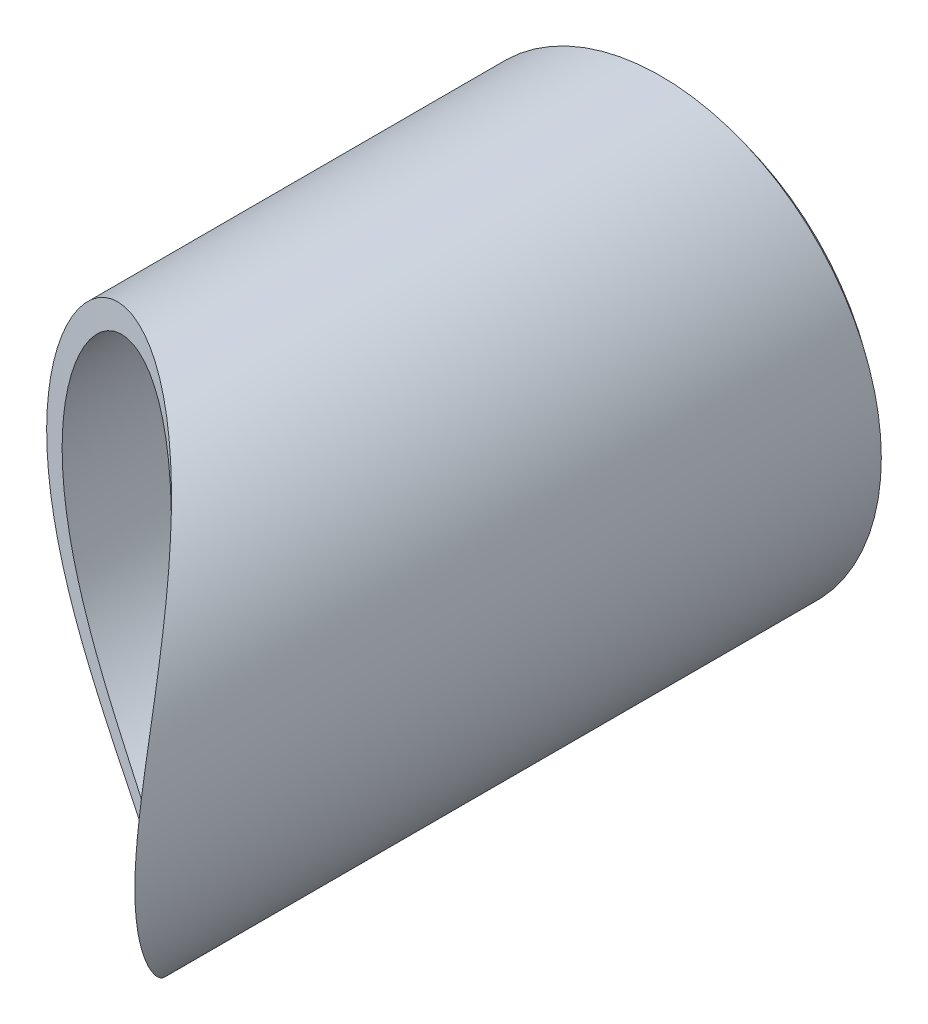
ISO-10303-21;
HEADER;
FILE_DESCRIPTION(('STEP AP214'),'2;1');
FILE_NAME('part.step','',(''),(''),'','','');
FILE_SCHEMA(('AUTOMOTIVE_DESIGN { 1 0 10303 214 1 1 1 1 }'));
ENDSEC;
DATA;
#1=APPLICATION_CONTEXT('core data for automotive mechanical design processes');
#2=APPLICATION_PROTOCOL_DEFINITION('international standard','automotive_design',2000,#1);
#3=PRODUCT_CONTEXT('',#1,'mechanical');
#4=PRODUCT('Part','Part','',(#3));
#5=PRODUCT_RELATED_PRODUCT_CATEGORY('part','',(#4));
#6=PRODUCT_DEFINITION_FORMATION('','',#4);
#7=PRODUCT_DEFINITION_CONTEXT('part definition',#1,'design');
#8=PRODUCT_DEFINITION('design','',#6,#7);
#9=PRODUCT_DEFINITION_SHAPE('','',#8);
#10=(LENGTH_UNIT() NAMED_UNIT(*) SI_UNIT(.MILLI.,.METRE.));
#11=(NAMED_UNIT(*) PLANE_ANGLE_UNIT() SI_UNIT($,.RADIAN.));
#12=(NAMED_UNIT(*) SI_UNIT($,.STERADIAN.) SOLID_ANGLE_UNIT());
#13=UNCERTAINTY_MEASURE_WITH_UNIT(LENGTH_MEASURE(1.E-05),#10,'distance_accuracy_value','');
#14=(GEOMETRIC_REPRESENTATION_CONTEXT(3) GLOBAL_UNCERTAINTY_ASSIGNED_CONTEXT((#13)) GLOBAL_UNIT_ASSIGNED_CONTEXT((#10,
#11,#12)) REPRESENTATION_CONTEXT('',''));
#15=CARTESIAN_POINT('',(0.,0.,0.));
#16=DIRECTION('',(0.,0.,1.));
#17=DIRECTION('',(1.,0.,0.));
#18=AXIS2_PLACEMENT_3D('',#15,#16,#17);
#19=CARTESIAN_POINT('',(0.,0.,98.425));
#20=DIRECTION('',(0.,0.,-1.));
#21=DIRECTION('',(-1.,0.,0.));
#22=AXIS2_PLACEMENT_3D('',#19,#20,#21);
#23=CYLINDRICAL_SURFACE('',#22,57.15);
#24=CARTESIAN_POINT('',(0.,0.,-95.0142315384335));
#25=DIRECTION('',(0.,0.,1.));
#26=DIRECTION('',(1.,0.,0.));
#27=AXIS2_PLACEMENT_3D('',#24,#25,#26);
#28=CIRCLE('',#27,57.15);
#29=CARTESIAN_POINT('',(57.15,0.,-95.0142315384335));
#30=VERTEX_POINT('',#29);
#31=EDGE_CURVE('E40',#30,#30,#28,.T.);
#32=ORIENTED_EDGE('',*,*,#31,.T.);
#33=EDGE_LOOP('',(#32));
#34=FACE_BOUND('',#33,.T.);
#35=CARTESIAN_POINT('',(57.15,0.,98.425));
#36=CARTESIAN_POINT('',(57.1499910400775,0.889774064658412,98.4249811147719));
#37=CARTESIAN_POINT('',(57.129162954309,1.77977253431634,98.3892348738455));
#38=CARTESIAN_POINT('',(57.0463978204173,3.55233045125769,98.2474793506042));
#39=CARTESIAN_POINT('',(56.9844476317462,4.43488742929305,98.1414476086068));
#40=CARTESIAN_POINT('',(56.8209401864099,6.18696293682297,97.8625519580691));
#41=CARTESIAN_POINT('',(56.7193232853382,7.05645977431301,97.6895874101758));
#42=CARTESIAN_POINT('',(56.4788981873427,8.77555385253664,97.2822475916354));
#43=CARTESIAN_POINT('',(56.3400878038766,9.62514992014327,97.0478687105607));
#44=CARTESIAN_POINT('',(55.9823478883623,11.546118004802,96.4472710214036));
#45=CARTESIAN_POINT('',(55.7518600610972,12.6095601507823,96.0625437758566));
#46=CARTESIAN_POINT('',(55.2396230085673,14.6921007305199,95.2152959598074));
#47=CARTESIAN_POINT('',(54.9578555500323,15.7111832312909,94.7527477232755));
#48=CARTESIAN_POINT('',(54.3483205300181,17.7051282811029,93.7624435495457));
#49=CARTESIAN_POINT('',(54.0204662717516,18.6799027974211,93.2345649444043));
#50=CARTESIAN_POINT('',(53.3241381783846,20.583641304642,92.1260683753142));
#51=CARTESIAN_POINT('',(52.9556637538368,21.5126046304861,91.5454496460647));
#52=CARTESIAN_POINT('',(52.2466700882524,23.1750447203111,90.4417426519371));
#53=CARTESIAN_POINT('',(51.9117296542151,23.9152949075571,89.925198006992));
#54=CARTESIAN_POINT('',(51.2183217018574,25.3663701142107,88.8669913293644));
#55=CARTESIAN_POINT('',(50.8598507591494,26.0771908261004,88.3253256442061));
#56=CARTESIAN_POINT('',(50.1208144042784,27.4708741560089,87.2206977474642));
#57=CARTESIAN_POINT('',(49.7402372133352,28.1537215325026,86.6577242392219));
#58=CARTESIAN_POINT('',(48.9584667422615,29.492230948926,85.5141770962944));
#59=CARTESIAN_POINT('',(48.5572742816129,30.1478940675938,84.9336041615834));
#60=CARTESIAN_POINT('',(47.7345297059954,31.4343962996623,83.756596883183));
#61=CARTESIAN_POINT('',(47.3129402346351,32.0651857044664,83.1601344107175));
#62=CARTESIAN_POINT('',(46.4509771401314,33.3016086068696,81.9548773370721));
#63=CARTESIAN_POINT('',(46.0106035433338,33.907242139749,81.3460827531894));
#64=CARTESIAN_POINT('',(45.1118498976267,35.094123636382,80.1183651231164));
#65=CARTESIAN_POINT('',(44.6534727473047,35.6753754946963,79.4994437166386));
#66=CARTESIAN_POINT('',(43.7192180061092,36.8143308711072,78.2531806201155));
#67=CARTESIAN_POINT('',(43.2433396767154,37.3720333933233,77.6258385754445));
#68=CARTESIAN_POINT('',(42.0370895815125,38.7322810608782,76.0550948522332));
#69=CARTESIAN_POINT('',(41.2963202785646,39.5208294157321,75.1075134388928));
#70=CARTESIAN_POINT('',(39.7782619560218,41.0484086065906,73.2016781205528));
#71=CARTESIAN_POINT('',(39.0009698547732,41.7874352513336,72.243423320197));
#72=CARTESIAN_POINT('',(37.410596597428,43.2170499976349,70.3196975018225));
#73=CARTESIAN_POINT('',(36.597501923324,43.9076195434993,69.3542238744089));
#74=CARTESIAN_POINT('',(34.9366514206708,45.2403187689698,67.4197361000174));
#75=CARTESIAN_POINT('',(34.088896456959,45.8824496560727,66.4507220419286));
#76=CARTESIAN_POINT('',(32.3587259914679,47.118644270921,64.5112569691816));
#77=CARTESIAN_POINT('',(31.4762831040879,47.7126688394741,63.5408054258426));
#78=CARTESIAN_POINT('',(29.678052148702,48.8514926273532,61.6018965787861));
#79=CARTESIAN_POINT('',(28.7622638939403,49.3962915709239,60.6334392862699));
#80=CARTESIAN_POINT('',(26.8981878754473,50.4355876511352,58.701154187758));
#81=CARTESIAN_POINT('',(25.9499054216804,50.9300929544814,57.7373256544375));
#82=CARTESIAN_POINT('',(24.0214554925153,51.8675387710817,55.8164942746231));
#83=CARTESIAN_POINT('',(23.041288064078,52.3104793602771,54.8594914180787));
#84=CARTESIAN_POINT('',(21.0442144480685,53.1454759309505,52.9491214374591));
#85=CARTESIAN_POINT('',(20.0271295828837,53.5372250404192,51.9958067658356));
#86=CARTESIAN_POINT('',(17.9626343561866,54.2647593376736,50.100680061435));
#87=CARTESIAN_POINT('',(16.9152238755295,54.6005443055496,49.1588680738708));
#88=CARTESIAN_POINT('',(14.7911352730209,55.2138299343915,47.2888453312902));
#89=CARTESIAN_POINT('',(13.7144509519428,55.4913181397406,46.3606375222548));
#90=CARTESIAN_POINT('',(11.5336096495677,55.9852508595995,44.5203601180559));
#91=CARTESIAN_POINT('',(10.4294529575446,56.2016960165744,43.6082903531377));
#92=CARTESIAN_POINT('',(8.19864512181479,56.5701265804876,41.805123590438));
#93=CARTESIAN_POINT('',(7.07206411954917,56.7222874631779,40.9139758533363));
#94=CARTESIAN_POINT('',(4.79576027825083,56.9599219807964,39.1524362355535));
#95=CARTESIAN_POINT('',(3.64603665254457,57.045393344847,38.2820450626426));
#96=CARTESIAN_POINT('',(1.32687088171356,57.1463760219798,36.5649319291847));
#97=CARTESIAN_POINT('',(0.157439279738828,57.1619236197947,35.7181979192582));
#98=CARTESIAN_POINT('',(-2.19816989984599,57.1198571615412,34.0505548148042));
#99=CARTESIAN_POINT('',(-3.38434519684025,57.0622529759937,33.2296422514508));
#100=CARTESIAN_POINT('',(-6.13111740728365,56.8415539341557,31.3715191157478));
#101=CARTESIAN_POINT('',(-7.6963027361189,56.6517922369752,30.3441045588633));
#102=CARTESIAN_POINT('',(-10.8382300462999,56.1354459376978,28.3427616871965));
#103=CARTESIAN_POINT('',(-12.4149695973508,55.8088893406908,27.3688224709052));
#104=CARTESIAN_POINT('',(-14.7788879786162,55.2120265168169,25.9522517433848));
#105=CARTESIAN_POINT('',(-15.5666352606521,54.995243532456,25.4874663776447));
#106=CARTESIAN_POINT('',(-17.1401295107344,54.5253368998854,24.5731906261596));
#107=CARTESIAN_POINT('',(-17.9258766707631,54.2722168845194,24.1236987169812));
#108=CARTESIAN_POINT('',(-19.4936580789043,53.7290257899441,23.2405227047032));
#109=CARTESIAN_POINT('',(-20.2756916920669,53.4389486120922,22.8068412258546));
#110=CARTESIAN_POINT('',(-21.8338589813834,52.8214661343986,21.9559563486431));
#111=CARTESIAN_POINT('',(-22.6099932946391,52.4940649283068,21.5387511498848));
#112=CARTESIAN_POINT('',(-24.1599343489337,51.7990983445948,20.7183246395271));
#113=CARTESIAN_POINT('',(-24.9336837648162,51.4312598877336,20.3152261306498));
#114=CARTESIAN_POINT('',(-26.4708364384821,50.6572571094413,19.5267193398757));
#115=CARTESIAN_POINT('',(-27.2342408999128,50.2510972913,19.1413089872686));
#116=CARTESIAN_POINT('',(-28.7485985778376,49.4003536969144,18.3884661272164));
#117=CARTESIAN_POINT('',(-29.499549851845,48.9557639922136,18.0210364073281));
#118=CARTESIAN_POINT('',(-30.986407283913,48.0284563190657,17.30458932782));
#119=CARTESIAN_POINT('',(-31.7223153210676,47.5457431498208,16.9555696598333));
#120=CARTESIAN_POINT('',(-33.1766134662327,46.5426144843583,16.2762124838732));
#121=CARTESIAN_POINT('',(-33.8950071261989,46.0222067191473,15.9458711696549));
#122=CARTESIAN_POINT('',(-35.311904217798,44.9442344679221,15.3040046257855));
#123=CARTESIAN_POINT('',(-36.0104101338126,44.386674652276,14.9924770404196));
#124=CARTESIAN_POINT('',(-37.3851607507702,43.2351272840137,14.3882966085619));
#125=CARTESIAN_POINT('',(-38.0614063120514,42.6411411417814,14.09564303219));
#126=CARTESIAN_POINT('',(-39.3892431423975,41.4176888470301,13.5292149823365));
#127=CARTESIAN_POINT('',(-40.0408351958803,40.7882238249566,13.2554399079561));
#128=CARTESIAN_POINT('',(-41.2424789346498,39.5704974243617,12.7575810449001));
#129=CARTESIAN_POINT('',(-41.7955022558026,38.986008901365,12.5314279671447));
#130=CARTESIAN_POINT('',(-42.8789615870869,37.7911046997486,12.0936808460015));
#131=CARTESIAN_POINT('',(-43.4093957282115,37.1806868840783,11.8820880064251));
#132=CARTESIAN_POINT('',(-44.4460084306339,35.9350977325234,11.4733898747764));
#133=CARTESIAN_POINT('',(-44.9521910259903,35.2999305456041,11.2762821702804));
#134=CARTESIAN_POINT('',(-45.9389869544839,34.0057962403385,10.8963309114666));
#135=CARTESIAN_POINT('',(-46.4195976518099,33.3468266802816,10.7134888266683));
#136=CARTESIAN_POINT('',(-47.3536235888651,32.0066198871775,10.3619659721538));
#137=CARTESIAN_POINT('',(-47.8070492537591,31.3253913470648,10.1932797637643));
#138=CARTESIAN_POINT('',(-48.6856470256179,29.9416435472693,9.86975517680552));
#139=CARTESIAN_POINT('',(-49.110816014081,29.2391219500299,9.71491832604776));
#140=CARTESIAN_POINT('',(-49.9315678232594,27.8143284612098,9.41889901597043));
#141=CARTESIAN_POINT('',(-50.3271545614664,27.0920592021161,9.27771474795042));
#142=CARTESIAN_POINT('',(-51.0877100098174,25.6290489424602,9.00871886651831));
#143=CARTESIAN_POINT('',(-51.4526758319303,24.8883062080882,8.88090851419522));
#144=CARTESIAN_POINT('',(-52.1276972604151,23.4397324989081,8.64648738129622));
#145=CARTESIAN_POINT('',(-52.4397902176008,22.7329864997053,8.53903217586433));
#146=CARTESIAN_POINT('',(-53.0356109247093,21.305970729964,8.33536088528168));
#147=CARTESIAN_POINT('',(-53.3193361516448,20.5856997632881,8.23914579968389));
#148=CARTESIAN_POINT('',(-53.8576576073134,19.1330868348688,8.05778204929041));
#149=CARTESIAN_POINT('',(-54.1122580249787,18.4007466263855,7.97263179283409));
#150=CARTESIAN_POINT('',(-54.5917706670708,16.9252232283236,7.81319380322691));
#151=CARTESIAN_POINT('',(-54.8166800485391,16.1820390079708,7.73890711020423));
#152=CARTESIAN_POINT('',(-55.4459199465276,13.9385547643318,7.53211583393716));
#153=CARTESIAN_POINT('',(-55.8049720923367,12.4237572136752,7.41560992135089));
#154=CARTESIAN_POINT('',(-56.3985377154593,9.36758021239772,7.22419998078131));
#155=CARTESIAN_POINT('',(-56.6330508675601,7.82620069237329,7.14929606143468));
#156=CARTESIAN_POINT('',(-56.9726876553426,4.75262276635806,7.04112985792062));
#157=CARTESIAN_POINT('',(-57.0798104911138,3.2206684470571,7.00722402375374));
#158=CARTESIAN_POINT('',(-57.1703969135752,0.152773116513686,6.97853941765266));
#159=CARTESIAN_POINT('',(-57.1538623173344,-1.38316783581614,6.98376007077907));
#160=CARTESIAN_POINT('',(-56.9972944143036,-4.44807704255366,7.03338195613771));
#161=CARTESIAN_POINT('',(-56.8572636074281,-5.97704543747601,7.0777823952596));
#162=CARTESIAN_POINT('',(-56.454979904614,-9.01713577617056,7.20623920209328));
#163=CARTESIAN_POINT('',(-56.1927267629719,-10.5282576840597,7.29029564952548));
#164=CARTESIAN_POINT('',(-55.5489710919375,-13.5192571100119,7.49874176723635));
#165=CARTESIAN_POINT('',(-55.1676787463672,-14.9991848278466,7.62306036223525));
#166=CARTESIAN_POINT('',(-54.2892245959994,-17.9200543902778,7.91324788210645));
#167=CARTESIAN_POINT('',(-53.7920632691397,-19.3609963956558,8.0791166355924));
#168=CARTESIAN_POINT('',(-52.6865597109506,-22.1937006706836,8.4538012387911));
#169=CARTESIAN_POINT('',(-52.0782243202989,-23.5854659599534,8.6626144461775));
#170=CARTESIAN_POINT('',(-50.7561264207044,-26.3102884453695,9.1247233755364));
#171=CARTESIAN_POINT('',(-50.042363713209,-27.6433455309437,9.37801918128366));
#172=CARTESIAN_POINT('',(-48.5138691475723,-30.2458502360163,9.93148677132656));
#173=CARTESIAN_POINT('',(-47.6988271234065,-31.5150848587846,10.2318033240382));
#174=CARTESIAN_POINT('',(-45.9775028173572,-33.9771681855979,10.8801308662355));
#175=CARTESIAN_POINT('',(-45.0712207805386,-35.1700170947959,11.2281417276181));
#176=CARTESIAN_POINT('',(-43.1763042802536,-37.4720115156937,11.9729720047747));
#177=CARTESIAN_POINT('',(-42.1876730389934,-38.5811602992255,12.369789511104));
#178=CARTESIAN_POINT('',(-40.1376185764926,-40.7096737260898,13.2129829481291));
#179=CARTESIAN_POINT('',(-39.0761943679625,-41.7290371512368,13.6593595510449));
#180=CARTESIAN_POINT('',(-36.8685127311026,-43.6928121719322,14.6114912957127));
#181=CARTESIAN_POINT('',(-35.7209716526914,-44.6352851332897,15.1182668251881));
#182=CARTESIAN_POINT('',(-33.3717272127158,-46.4179353671675,16.1833694518489));
#183=CARTESIAN_POINT('',(-32.1700234160121,-47.2581118176439,16.7416969632371));
#184=CARTESIAN_POINT('',(-29.7234083057624,-48.8339956092412,17.9090574684098));
#185=CARTESIAN_POINT('',(-28.478492623711,-49.5696923494837,18.5180955975409));
#186=CARTESIAN_POINT('',(-25.9563665897467,-50.9357109999795,19.7853488121546));
#187=CARTESIAN_POINT('',(-24.679155130327,-51.5660292908722,20.4435655856192));
#188=CARTESIAN_POINT('',(-22.0173932444875,-52.7600513312128,21.8523472180923));
#189=CARTESIAN_POINT('',(-20.6313349965076,-53.3165811278752,22.606140984983));
#190=CARTESIAN_POINT('',(-17.8457671197713,-54.3124233866673,24.1643994505471));
#191=CARTESIAN_POINT('',(-16.4462569768705,-54.7517313498596,24.9688660925653));
#192=CARTESIAN_POINT('',(-13.6436899647172,-55.5165101950275,26.6253762649662));
#193=CARTESIAN_POINT('',(-12.2406319827773,-55.8419392605832,27.4774371390877));
#194=CARTESIAN_POINT('',(-9.44061818299503,-56.3828948506311,29.2251957556841));
#195=CARTESIAN_POINT('',(-8.0436626508633,-56.5984162828897,30.1208955179274));
#196=CARTESIAN_POINT('',(-5.07339591819372,-56.9465943949303,32.0774972973791));
#197=CARTESIAN_POINT('',(-3.50211896791251,-57.063870324689,33.1442301442493));
#198=CARTESIAN_POINT('',(-0.387302576644447,-57.1699355306245,35.3234491160523));
#199=CARTESIAN_POINT('',(1.15623463615178,-57.1587145310959,36.4359388930094));
#200=CARTESIAN_POINT('',(4.20788070988051,-57.015346737565,38.7010530479708));
#201=CARTESIAN_POINT('',(5.71598656091115,-56.8831897078457,39.8536808152087));
#202=CARTESIAN_POINT('',(8.69050393665073,-56.5052710435671,42.1934211087785));
#203=CARTESIAN_POINT('',(10.1569135967963,-56.2595043370835,43.3805351724789));
#204=CARTESIAN_POINT('',(13.3332599264386,-55.6010761648655,46.0253336369455));
#205=CARTESIAN_POINT('',(15.0329516747082,-55.1648080375816,47.4894722771992));
#206=CARTESIAN_POINT('',(18.3591922227509,-54.1487534549558,50.4506884091224));
#207=CARTESIAN_POINT('',(19.985731741598,-53.5689488492967,51.9477700446336));
#208=CARTESIAN_POINT('',(23.164351192207,-52.2731994503254,54.9689119462933));
#209=CARTESIAN_POINT('',(24.7162676472846,-51.5569714206926,56.4930222497846));
#210=CARTESIAN_POINT('',(27.738671834637,-49.9958194024582,59.5560738128631));
#211=CARTESIAN_POINT('',(29.2091596915399,-49.1508956108356,61.095015049747));
#212=CARTESIAN_POINT('',(31.5018205665501,-47.6949270845771,63.5691773196806));
#213=CARTESIAN_POINT('',(32.350812762759,-47.1231876822518,64.5029544642687));
#214=CARTESIAN_POINT('',(34.0173743777513,-45.9346101408926,66.3700069016476));
#215=CARTESIAN_POINT('',(34.8349426762976,-45.3177703963382,67.3032821753799));
#216=CARTESIAN_POINT('',(36.4383039562831,-44.03889871684,69.1670873070171));
#217=CARTESIAN_POINT('',(37.2240822728251,-43.3768462951779,70.097615718359));
#218=CARTESIAN_POINT('',(38.7627354416338,-42.0075406478318,71.9525832769221));
#219=CARTESIAN_POINT('',(39.5156110250146,-41.3002884273694,72.8770225590584));
#220=CARTESIAN_POINT('',(40.9854729311116,-39.8419662276048,74.7138435662787));
#221=CARTESIAN_POINT('',(41.7025565148637,-39.0910285292224,75.6262523803004));
#222=CARTESIAN_POINT('',(43.1021074001536,-37.5422473911112,77.4379087676232));
#223=CARTESIAN_POINT('',(43.7845725321977,-36.7444010184244,78.3371555135682));
#224=CARTESIAN_POINT('',(45.1128903281482,-35.1007873910761,80.1170691247188));
#225=CARTESIAN_POINT('',(45.7587721440599,-34.2550593977277,80.9977504224661));
#226=CARTESIAN_POINT('',(47.012559115436,-32.5129725966537,82.7354763837304));
#227=CARTESIAN_POINT('',(47.6204720213412,-31.6166241934711,83.5925258510367));
#228=CARTESIAN_POINT('',(48.730643831049,-29.8729464740768,85.1825204821126));
#229=CARTESIAN_POINT('',(49.237135731438,-29.0312429407893,85.9186713627392));
#230=CARTESIAN_POINT('',(50.2159619401451,-27.3032168823223,87.3606428586062));
#231=CARTESIAN_POINT('',(50.6883003639872,-26.4168997550245,88.066467124057));
#232=CARTESIAN_POINT('',(51.5965886951204,-24.5957601671128,89.4412274403981));
#233=CARTESIAN_POINT('',(52.0324868672895,-23.6608717004831,90.1101106030707));
#234=CARTESIAN_POINT('',(52.8633825521465,-21.7411830853815,91.4004579266258));
#235=CARTESIAN_POINT('',(53.258378920882,-20.7563815420744,92.0219207611164));
#236=CARTESIAN_POINT('',(54.0086493304506,-18.7186100425273,93.2152663944184));
#237=CARTESIAN_POINT('',(54.3631761313386,-17.6647941572697,93.7861827998779));
#238=CARTESIAN_POINT('',(55.0188118640045,-15.5025196006315,94.8522276374408));
#239=CARTESIAN_POINT('',(55.3199101411214,-14.3940500864734,95.3473409502753));
#240=CARTESIAN_POINT('',(55.7250885547715,-12.6954390849221,96.0188770409134));
#241=CARTESIAN_POINT('',(55.8521831842316,-12.1244957802824,96.2304938970368));
#242=CARTESIAN_POINT('',(56.0902487763551,-10.9705670430776,96.6283255754021));
#243=CARTESIAN_POINT('',(56.2012227164551,-10.3875838570145,96.8145450880577));
#244=CARTESIAN_POINT('',(56.4059963787829,-9.21099282149065,97.1592343946397));
#245=CARTESIAN_POINT('',(56.4998094784088,-8.61739364721983,97.3177257992325));
#246=CARTESIAN_POINT('',(56.6694118368375,-7.42060332759574,97.6049833551797));
#247=CARTESIAN_POINT('',(56.7452052730279,-6.81741444002672,97.7337563957558));
#248=CARTESIAN_POINT('',(56.867299387964,-5.70050708342202,97.9415920476704));
#249=CARTESIAN_POINT('',(56.9163806406674,-5.18795572242237,98.0253150557154));
#250=CARTESIAN_POINT('',(57.0008351875482,-4.15859112525482,98.169549813611));
#251=CARTESIAN_POINT('',(57.0362119452117,-3.64177899965835,98.2300674280354));
#252=CARTESIAN_POINT('',(57.09296351897,-2.60492475982987,98.3272195738914));
#253=CARTESIAN_POINT('',(57.1143327576908,-2.08488144212893,98.36384459198));
#254=CARTESIAN_POINT('',(57.1428542639484,-1.04325121788218,98.4127414360457));
#255=CARTESIAN_POINT('',(57.1500052530983,-0.521664176759694,98.4250110721894));
#256=CARTESIAN_POINT('',(57.15,0.,98.425));
#257=B_SPLINE_CURVE_WITH_KNOTS('',3,(#35,#36,#37,#38,#39,#40,#41,#42,#43,#44,#45,#46,#47,#48,
#49,#50,#51,#52,#53,#54,#55,#56,#57,#58,#59,#60,#61,#62,#63,#64,#65,#66,#67,#68,#69,#70,#71,#72,
#73,#74,#75,#76,#77,#78,#79,#80,#81,#82,#83,#84,#85,#86,#87,#88,#89,#90,#91,#92,#93,#94,#95,#96,
#97,#98,#99,#100,#101,#102,#103,#104,#105,#106,#107,#108,#109,#110,#111,#112,#113,#114,#115,
#116,#117,#118,#119,#120,#121,#122,#123,#124,#125,#126,#127,#128,#129,#130,#131,#132,#133,#134,
#135,#136,#137,#138,#139,#140,#141,#142,#143,#144,#145,#146,#147,#148,#149,#150,#151,#152,#153,
#154,#155,#156,#157,#158,#159,#160,#161,#162,#163,#164,#165,#166,#167,#168,#169,#170,#171,#172,
#173,#174,#175,#176,#177,#178,#179,#180,#181,#182,#183,#184,#185,#186,#187,#188,#189,#190,#191,
#192,#193,#194,#195,#196,#197,#198,#199,#200,#201,#202,#203,#204,#205,#206,#207,#208,#209,#210,
#211,#212,#213,#214,#215,#216,#217,#218,#219,#220,#221,#222,#223,#224,#225,#226,#227,#228,#229,
#230,#231,#232,#233,#234,#235,#236,#237,#238,#239,#240,#241,#242,#243,#244,#245,#246,#247,#248,
#249,#250,#251,#252,#253,#254,#255,#256),.UNSPECIFIED.,.T.,.F.,(4,2,2,2,2,2,2,2,2,2,2,2,2,2,2,2,
2,2,2,2,2,2,2,2,2,2,2,2,2,2,2,2,2,2,2,2,2,2,2,2,2,2,2,2,2,2,2,2,2,2,2,2,2,2,2,2,2,2,2,2,2,2,2,2,
2,2,2,2,2,2,2,2,2,2,2,2,2,2,2,2,2,2,2,2,2,2,2,2,2,2,2,2,2,2,2,2,2,2,2,2,2,2,2,2,2,2,2,2,2,2,4),
(0.,2.66876676266764,5.33838673925711,8.0120364189204,10.6858433124516,14.1428164984105,
17.6010212749839,21.0658207926694,24.5306705953686,27.4179503529368,30.3056512310069,
33.1949051218838,36.0840442501299,38.9786913597273,41.8733344095484,44.7675133145064,
47.6618144893916,51.9749494226634,56.2884489375325,60.6035913086715,64.9186260747697,
69.2371387510247,73.5556756175004,77.8735101145026,82.1913382523789,86.5339661935313,
90.8766111985254,95.2201831063681,99.5637092973346,103.895301205211,108.227040603825,
112.556531923375,116.885439117812,122.525499278518,128.164405351907,130.983664839862,
133.802642664589,136.622086278854,139.441220949697,142.280722567636,145.119890919481,
147.95949804516,150.79874827271,153.637417821626,156.475731193401,159.313934738365,
162.152047902158,164.658719646846,167.16559838977,169.672058674452,172.17877681281,
174.684527420828,177.190554114231,179.696248351911,182.202178650695,184.541546428503,
186.881122081758,189.220360816803,191.559823375034,196.236931486831,200.91405181206,
205.516760121436,210.11940079701,214.721948304179,219.324505063883,223.918980759211,
228.513437503527,233.107611640362,237.701794429569,242.310410585759,246.919014363826,
251.527437898475,256.135923949446,260.837845088982,265.539804010154,270.242239668267,
274.944836804518,279.958800332633,284.972956267432,289.988951476895,295.005179066025,
300.708034400071,306.411345786036,312.115139930377,317.819188736181,324.668917136905,
331.519512134784,338.384488200353,345.249453758643,349.405002359374,353.560698964966,
357.718291251937,361.875791108225,366.021298307649,370.167064980522,374.309480159095,
378.451046980815,382.132265495939,385.813039679191,389.498953809646,393.184971000883,
396.930706961363,400.677189055216,402.542558508168,404.40758299447,406.271147383557,
408.134279331825,409.69857883231,411.262482734869,412.827008959418,414.391675846787),.UNSPECIFIED.);
#258=CARTESIAN_POINT('',(57.15,0.,98.425));
#259=VERTEX_POINT('',#258);
#260=EDGE_CURVE('E48',#259,#259,#257,.T.);
#261=ORIENTED_EDGE('',*,*,#260,.F.);
#262=EDGE_LOOP('',(#261));
#263=FACE_BOUND('',#262,.T.);
#264=ADVANCED_FACE('F33',(#34,#263),#23,.T.);
#265=CARTESIAN_POINT('',(0.,0.,98.425));
#266=DIRECTION('',(0.,0.,-1.));
#267=DIRECTION('',(-1.,0.,0.));
#268=AXIS2_PLACEMENT_3D('',#265,#266,#267);
#269=CYLINDRICAL_SURFACE('',#268,51.1302);
#270=CARTESIAN_POINT('',(0.,0.,-98.425));
#271=DIRECTION('',(0.,0.,1.));
#272=DIRECTION('',(1.,0.,0.));
#273=AXIS2_PLACEMENT_3D('',#270,#271,#272);
#274=CIRCLE('',#273,51.1302);
#275=CARTESIAN_POINT('',(51.1302,0.,-98.425));
#276=VERTEX_POINT('',#275);
#277=EDGE_CURVE('E44',#276,#276,#274,.T.);
#278=ORIENTED_EDGE('',*,*,#277,.F.);
#279=EDGE_LOOP('',(#278));
#280=FACE_BOUND('',#279,.T.);
#281=CARTESIAN_POINT('',(-51.1302,0.,8.99421505691642));
#282=CARTESIAN_POINT('',(-51.1301982854444,-1.36389966855036,8.99421599497874));
#283=CARTESIAN_POINT('',(-51.0755829074996,-2.72779920358037,9.0133707408241));
#284=CARTESIAN_POINT('',(-50.8576424987409,-5.44575366158632,9.090121412942));
#285=CARTESIAN_POINT('',(-50.6943206807575,-6.79980887431664,9.14771620311503));
#286=CARTESIAN_POINT('',(-50.2605601416113,-9.48826794047126,9.30171653486037));
#287=CARTESIAN_POINT('',(-49.9901323715896,-10.8226737884991,9.39811810861589));
#288=CARTESIAN_POINT('',(-49.3447617627849,-13.4624701368029,9.63032631847547));
#289=CARTESIAN_POINT('',(-48.9698182477083,-14.767860449268,9.76613320956109));
#290=CARTESIAN_POINT('',(-48.1192116520176,-17.3399218090998,10.0778437545735));
#291=CARTESIAN_POINT('',(-47.6435862303439,-18.6066071314768,10.2537324182389));
#292=CARTESIAN_POINT('',(-46.5961742735322,-21.0929765984834,10.6464653218148));
#293=CARTESIAN_POINT('',(-46.0243882197554,-22.312660978353,10.8633093567114));
#294=CARTESIAN_POINT('',(-44.7902846353531,-24.6967487433499,11.3387697354726));
#295=CARTESIAN_POINT('',(-44.1279709473405,-25.861154472057,11.5973843063941));
#296=CARTESIAN_POINT('',(-42.7192946012051,-28.1271949646609,12.1571192155635));
#297=CARTESIAN_POINT('',(-41.9729313364139,-29.2288292753882,12.4582398606237));
#298=CARTESIAN_POINT('',(-40.3960975905077,-31.3725950935262,13.1065462442405));
#299=CARTESIAN_POINT('',(-39.5649045895765,-32.4140723812195,13.4541371542694));
#300=CARTESIAN_POINT('',(-37.8325186077744,-34.4202622872098,14.1934305720783));
#301=CARTESIAN_POINT('',(-36.9313255975323,-35.3849748732969,14.585133098367));
#302=CARTESIAN_POINT('',(-35.0676029702319,-37.23281697731,15.4125728202073));
#303=CARTESIAN_POINT('',(-34.1050713414977,-38.1159438172012,15.8483114602527));
#304=CARTESIAN_POINT('',(-32.1276897284209,-39.7968970322151,16.7633233080172));
#305=CARTESIAN_POINT('',(-31.1128383745836,-40.5947211728157,17.2425976555553));
#306=CARTESIAN_POINT('',(-28.9944114881387,-42.1356304376752,18.2657473866002));
#307=CARTESIAN_POINT('',(-27.8888967843227,-42.8747790659145,18.8115343487819));
#308=CARTESIAN_POINT('',(-25.6409432334756,-44.2558449181377,19.9480546310895));
#309=CARTESIAN_POINT('',(-24.4985035189596,-44.8977598557777,20.5387890076141));
#310=CARTESIAN_POINT('',(-22.1862313297204,-46.0842435315552,21.76339296299));
#311=CARTESIAN_POINT('',(-21.0163930153435,-46.6287912996295,22.3972717934162));
#312=CARTESIAN_POINT('',(-18.658715940632,-47.6212757428867,23.7057470387272));
#313=CARTESIAN_POINT('',(-17.4708764384482,-48.0692084248013,24.380345135135));
#314=CARTESIAN_POINT('',(-14.9677593764618,-48.9098601258869,25.8362189356166));
#315=CARTESIAN_POINT('',(-13.6514827871244,-49.2927558197843,26.6214501257));
#316=CARTESIAN_POINT('',(-11.0173374681478,-49.9475520971311,28.2342276577766));
#317=CARTESIAN_POINT('',(-9.69946865049521,-50.2194462340789,29.0617764542579));
#318=CARTESIAN_POINT('',(-7.07039645265273,-50.6565223254074,30.7555567120579));
#319=CARTESIAN_POINT('',(-5.75919545926922,-50.8216684159224,31.6218010694342));
#320=CARTESIAN_POINT('',(-3.15129288988085,-51.0497829606533,33.3887398748829));
#321=CARTESIAN_POINT('',(-1.85459199174228,-51.1127466576029,34.2894359249113));
#322=CARTESIAN_POINT('',(0.92791152560121,-51.1436695330543,36.2707172154162));
#323=CARTESIAN_POINT('',(2.41007805210078,-51.0944663214737,37.356690087103));
#324=CARTESIAN_POINT('',(5.33845946533065,-50.8719476325236,39.5637399168266));
#325=CARTESIAN_POINT('',(6.78467088981421,-50.698620250318,40.6848202321795));
#326=CARTESIAN_POINT('',(9.63557932047591,-50.2348469043774,42.9566201008672));
#327=CARTESIAN_POINT('',(11.0402532605875,-49.9443371322486,44.1073554819491));
#328=CARTESIAN_POINT('',(13.8023205908158,-49.2526181265426,46.4319291662773));
#329=CARTESIAN_POINT('',(15.1597122167597,-48.8514047674237,47.6057683290076));
#330=CARTESIAN_POINT('',(18.0901014453107,-47.8528809989319,50.2075321046208));
#331=CARTESIAN_POINT('',(19.6518418263859,-47.2323907464995,51.6392657589212));
#332=CARTESIAN_POINT('',(22.6964722275008,-45.8471972696413,54.5174215364715));
#333=CARTESIAN_POINT('',(24.1793476713749,-45.0824675041605,55.9638463165704));
#334=CARTESIAN_POINT('',(26.3411849340893,-43.8307342494772,58.136216540128));
#335=CARTESIAN_POINT('',(27.0517552841877,-43.3957841660601,58.8611917219433));
#336=CARTESIAN_POINT('',(28.4513909543847,-42.4912938246458,60.3104308792937));
#337=CARTESIAN_POINT('',(29.1404560554889,-42.0217532145663,61.0346948475136));
#338=CARTESIAN_POINT('',(30.4963245142187,-41.0483606155251,62.4806845994254));
#339=CARTESIAN_POINT('',(31.1631317373251,-40.5445146309971,63.202410804162));
#340=CARTESIAN_POINT('',(32.4739873853469,-39.5023871074713,64.6416457538524));
#341=CARTESIAN_POINT('',(33.1180364477676,-38.9641065342499,65.3591546164729));
#342=CARTESIAN_POINT('',(34.2832229051772,-37.9402313317604,66.6755784905497));
#343=CARTESIAN_POINT('',(34.8077614475688,-37.4596635934839,67.2753988643264));
#344=CARTESIAN_POINT('',(35.8396931195182,-36.4735939524428,68.4692561630198));
#345=CARTESIAN_POINT('',(36.3470866516371,-35.9680926357995,69.0632932234941));
#346=CARTESIAN_POINT('',(37.3442627713228,-34.9316565068105,70.2441746534818));
#347=CARTESIAN_POINT('',(37.8340424375897,-34.4007175093122,70.8310178193304));
#348=CARTESIAN_POINT('',(38.7952508277639,-33.3129504005967,71.9956916989438));
#349=CARTESIAN_POINT('',(39.2666796063625,-32.7561223665478,72.5735224395655));
#350=CARTESIAN_POINT('',(40.1895906737579,-31.6169350644062,73.7171838942379));
#351=CARTESIAN_POINT('',(40.6411070439214,-31.0346231120456,74.2830341757894));
#352=CARTESIAN_POINT('',(41.5241805124682,-29.8427530546299,75.40155335935));
#353=CARTESIAN_POINT('',(41.9557369465519,-29.2331940440736,75.9542218223504));
#354=CARTESIAN_POINT('',(42.797579279391,-27.9862501770843,77.0434862264128));
#355=CARTESIAN_POINT('',(43.2078748308703,-27.3488781945793,77.580089413762));
#356=CARTESIAN_POINT('',(44.006017363174,-26.0451890464505,78.634342459481));
#357=CARTESIAN_POINT('',(44.3938670464826,-25.3788753823886,79.1519945967898));
#358=CARTESIAN_POINT('',(45.2206685167455,-23.8801199142198,80.266019456527));
#359=CARTESIAN_POINT('',(45.6543575292412,-23.0410753396253,80.8574681920211));
#360=CARTESIAN_POINT('',(46.4838016121611,-21.3182420379423,82.0006476792919));
#361=CARTESIAN_POINT('',(46.8795582584713,-20.4344551719888,82.5523800808317));
#362=CARTESIAN_POINT('',(47.6285712452032,-18.6219510503187,83.6067154917896));
#363=CARTESIAN_POINT('',(47.9818720306822,-17.6932822334392,84.1093697735616));
#364=CARTESIAN_POINT('',(48.6413566551051,-15.7901627323207,85.0556790749055));
#365=CARTESIAN_POINT('',(48.9475510223526,-14.815722341784,85.4993472748714));
#366=CARTESIAN_POINT('',(49.4489250156277,-13.0297268252882,86.2310663860858));
#367=CARTESIAN_POINT('',(49.6539558331113,-12.2263405718798,86.5323038003988));
#368=CARTESIAN_POINT('',(50.0276466589216,-10.5939909954182,87.0839977396567));
#369=CARTESIAN_POINT('',(50.1963104133545,-9.76503031680589,87.3344594947527));
#370=CARTESIAN_POINT('',(50.4939918918511,-8.08580806772042,87.7781651848628));
#371=CARTESIAN_POINT('',(50.6230515439516,-7.23557006205573,87.9714696231779));
#372=CARTESIAN_POINT('',(50.8389538731018,-5.51789475819288,88.2956669798175));
#373=CARTESIAN_POINT('',(50.9257971102874,-4.65045768835433,88.4265607262193));
#374=CARTESIAN_POINT('',(51.0555686364325,-2.89874641666578,88.6224016106765));
#375=CARTESIAN_POINT('',(51.0981903167771,-2.0143973955669,88.6868882949749));
#376=CARTESIAN_POINT('',(51.137305520593,-0.242325681811399,88.7460635376804));
#377=CARTESIAN_POINT('',(51.1337991718099,0.645397001495492,88.7407522893838));
#378=CARTESIAN_POINT('',(51.0807493041597,2.41654489059664,88.6605124186742));
#379=CARTESIAN_POINT('',(51.0311914189035,3.29996866883324,88.5855620714193));
#380=CARTESIAN_POINT('',(50.8873425280676,5.05478125354513,88.3686071644904));
#381=CARTESIAN_POINT('',(50.7930517788661,5.92617012896681,88.2266029891232));
#382=CARTESIAN_POINT('',(50.5729271805731,7.56954441656064,87.8964058242016));
#383=CARTESIAN_POINT('',(50.4508868117692,8.34318033189048,87.7138023435638));
#384=CARTESIAN_POINT('',(50.1741924955634,9.87172627105245,87.3016349308572));
#385=CARTESIAN_POINT('',(50.0195417253692,10.6266381111553,87.0720755737305));
#386=CARTESIAN_POINT('',(49.6799685870079,12.1153286395432,86.5706662301797));
#387=CARTESIAN_POINT('',(49.4950417252906,12.849104171757,86.2988099663849));
#388=CARTESIAN_POINT('',(49.0972569506835,14.2939990041762,85.7175227651998));
#389=CARTESIAN_POINT('',(48.8843917202176,15.0051123078686,85.408081985318));
#390=CARTESIAN_POINT('',(48.4672989876467,16.2974458031789,84.8057523786508));
#391=CARTESIAN_POINT('',(48.2666653661015,16.8819974405963,84.5174814602243));
#392=CARTESIAN_POINT('',(47.8482592565133,18.033767952132,83.9198845627562));
#393=CARTESIAN_POINT('',(47.6304891996834,18.6009892691754,83.610561571293));
#394=CARTESIAN_POINT('',(46.952904173998,20.2774766824604,82.6541918578002));
#395=CARTESIAN_POINT('',(46.4689652290071,21.3611043754142,81.9789634433501));
#396=CARTESIAN_POINT('',(45.4433902630004,23.464204669739,80.5682480887236));
#397=CARTESIAN_POINT('',(44.9015900381567,24.4834808855293,79.8325911001247));
#398=CARTESIAN_POINT('',(43.7673882214561,26.4576783338588,78.3157709021194));
#399=CARTESIAN_POINT('',(43.1749898412708,27.4126036441395,77.5346105819947));
#400=CARTESIAN_POINT('',(42.0702548606696,29.0718145693918,76.100824456167));
#401=CARTESIAN_POINT('',(41.5663688525231,29.7873785024168,75.4546393216575));
#402=CARTESIAN_POINT('',(40.5311828840091,31.1813135210075,74.1441763222579));
#403=CARTESIAN_POINT('',(39.9998797459724,31.8596802765101,73.4798963643937));
#404=CARTESIAN_POINT('',(38.911118100064,33.1806443479322,72.1365909021718));
#405=CARTESIAN_POINT('',(38.3536471637527,33.8232243435158,71.4575584750514));
#406=CARTESIAN_POINT('',(37.2139762694051,35.0732465155175,70.0880977982628));
#407=CARTESIAN_POINT('',(36.6317771473638,35.6806898781755,69.3976699343261));
#408=CARTESIAN_POINT('',(35.4431784002372,36.8616439090608,68.0074972765923));
#409=CARTESIAN_POINT('',(34.8367618316015,37.4351300974558,67.3077461963202));
#410=CARTESIAN_POINT('',(33.6009267071424,38.5482377907556,65.9016641957171));
#411=CARTESIAN_POINT('',(32.9715080117718,39.0878590901578,65.1953332354873));
#412=CARTESIAN_POINT('',(31.6904983002038,40.1334407478802,63.7782298874442));
#413=CARTESIAN_POINT('',(31.0389118176408,40.6394079271478,63.0674584317637));
#414=CARTESIAN_POINT('',(29.7140658518887,41.6179024619373,61.643116227463));
#415=CARTESIAN_POINT('',(29.04080631129,42.0904297288702,60.9295454714321));
#416=CARTESIAN_POINT('',(27.6451156107777,43.0206553219893,59.4719176694964));
#417=CARTESIAN_POINT('',(26.9218002294962,43.4769507604068,58.727810503107));
#418=CARTESIAN_POINT('',(25.4529441872623,44.3528594149509,57.2400349929352));
#419=CARTESIAN_POINT('',(24.7074033699061,44.7724723728554,56.4963666522786));
#420=CARTESIAN_POINT('',(22.4381576073892,45.9756355474089,54.2682317494224));
#421=CARTESIAN_POINT('',(20.8817103441442,46.7035894072024,52.7865106853079));
#422=CARTESIAN_POINT('',(17.6889125643618,48.0038361668466,49.8442217269822));
#423=CARTESIAN_POINT('',(16.0526324700363,48.576263432931,48.3836366121372));
#424=CARTESIAN_POINT('',(12.7053007212882,49.5571696424631,45.4933862695693));
#425=CARTESIAN_POINT('',(10.9942608947137,49.9656744169287,44.0637162038515));
#426=CARTESIAN_POINT('',(7.73233038947762,50.5656996732013,41.4292040228052));
#427=CARTESIAN_POINT('',(6.18946432429827,50.7784960782903,40.2192582949889));
#428=CARTESIAN_POINT('',(3.06083382602945,51.0626615757743,37.8384805915717));
#429=CARTESIAN_POINT('',(1.47507032236959,51.1340337298286,36.6676477697645));
#430=CARTESIAN_POINT('',(-1.72848968094445,51.1260522696594,34.3736754501765));
#431=CARTESIAN_POINT('',(-3.3462589090499,51.0468219339152,33.250497712793));
#432=CARTESIAN_POINT('',(-6.60290871904873,50.7284376931598,31.0586351241593));
#433=CARTESIAN_POINT('',(-8.241785716177,50.4893106013901,29.9899411688033));
#434=CARTESIAN_POINT('',(-11.2534036950395,49.8959664709193,28.086740788365));
#435=CARTESIAN_POINT('',(-12.6252390781925,49.5673900055272,27.242774901554));
#436=CARTESIAN_POINT('',(-15.3627408536227,48.7884048798688,25.6024240788609));
#437=CARTESIAN_POINT('',(-16.7284078421035,48.3380082618654,24.8060344494278));
#438=CARTESIAN_POINT('',(-19.4417777835083,47.3119111341121,23.264887052592));
#439=CARTESIAN_POINT('',(-20.7894840344829,46.7362339751232,22.5201196974908));
#440=CARTESIAN_POINT('',(-22.7873456643261,45.7775126612248,21.444536690739));
#441=CARTESIAN_POINT('',(-23.4494512779612,45.4420115708128,21.0928854522773));
#442=CARTESIAN_POINT('',(-24.7640597509209,44.7391769469901,20.4037940281906));
#443=CARTESIAN_POINT('',(-25.4165636428254,44.3718468662069,20.0663523070843));
#444=CARTESIAN_POINT('',(-26.7142419447271,43.6029707820994,19.4039530924351));
#445=CARTESIAN_POINT('',(-27.3593441580326,43.2012235637285,19.0790877750195));
#446=CARTESIAN_POINT('',(-28.6360244538767,42.365756645881,18.4444589206792));
#447=CARTESIAN_POINT('',(-29.2676040973913,41.9320406626734,18.1346936353562));
#448=CARTESIAN_POINT('',(-30.5154662292937,41.0328549890705,17.5304521888121));
#449=CARTESIAN_POINT('',(-31.1317463186036,40.5673803610565,17.2359784176028));
#450=CARTESIAN_POINT('',(-32.3468698627678,39.6052751760385,16.6626265674303));
#451=CARTESIAN_POINT('',(-32.9457154514177,39.1086484553853,16.3837465760771));
#452=CARTESIAN_POINT('',(-34.1239775593019,38.0849114290317,15.8417581873271));
#453=CARTESIAN_POINT('',(-34.703397549247,37.5578066151064,15.5786469658855));
#454=CARTESIAN_POINT('',(-35.8409031940201,36.4738828213442,15.0682846199969));
#455=CARTESIAN_POINT('',(-36.3989914458456,35.9170674784702,14.8210315624227));
#456=CARTESIAN_POINT('',(-37.4919732138121,34.7746205041851,14.3424176679364));
#457=CARTESIAN_POINT('',(-38.0268674588711,34.1889897795919,14.1110563314613));
#458=CARTESIAN_POINT('',(-39.0716036387113,32.9899887968767,13.6642298260637));
#459=CARTESIAN_POINT('',(-39.581446301455,32.3766193457975,13.4487641951436));
#460=CARTESIAN_POINT('',(-40.5196259912566,31.1923617497811,13.0565383138635));
#461=CARTESIAN_POINT('',(-40.9507571251223,30.6242297143898,12.8781282918015));
#462=CARTESIAN_POINT('',(-41.790583902056,29.4678653829181,12.5337910713832));
#463=CARTESIAN_POINT('',(-42.1992776916248,28.879631432756,12.3678649038723));
#464=CARTESIAN_POINT('',(-42.9929583418457,27.6842468624028,12.048463191841));
#465=CARTESIAN_POINT('',(-43.3779491533384,27.0770994202808,11.8949855710208));
#466=CARTESIAN_POINT('',(-44.1232402894362,25.844836053248,11.6003378163157));
#467=CARTESIAN_POINT('',(-44.4835380940507,25.2197183036299,11.4591689381734));
#468=CARTESIAN_POINT('',(-45.1782625007047,23.9529460772709,11.1890868392244));
#469=CARTESIAN_POINT('',(-45.5126971474388,23.3112968260889,11.0601698046216));
#470=CARTESIAN_POINT('',(-46.1549001997074,22.0124387300989,10.8144058621616));
#471=CARTESIAN_POINT('',(-46.4626657470816,21.3552282271586,10.6975602477561));
#472=CARTESIAN_POINT('',(-47.0505805332143,20.0266781847849,10.4758382425737));
#473=CARTESIAN_POINT('',(-47.3307328318383,19.3553402208637,10.3709605254126));
#474=CARTESIAN_POINT('',(-47.8626905747846,17.9997337088162,10.1730180338));
#475=CARTESIAN_POINT('',(-48.1144932156475,17.3154638896764,10.0799544275142));
#476=CARTESIAN_POINT('',(-48.5800819397763,15.9613943760549,9.90880355117048));
#477=CARTESIAN_POINT('',(-48.7949415046657,15.2920180903831,9.83028472058919));
#478=CARTESIAN_POINT('',(-49.1971730793574,13.9438312648204,9.68396261489823));
#479=CARTESIAN_POINT('',(-49.3845424417581,13.2650198231737,9.6161603717844));
#480=CARTESIAN_POINT('',(-49.731258966498,11.8993859791891,9.49118552360756));
#481=CARTESIAN_POINT('',(-49.8906095921609,11.2125645781487,9.43401160475467));
#482=CARTESIAN_POINT('',(-50.1809141835033,9.83213873239436,9.33019022795323));
#483=CARTESIAN_POINT('',(-50.3118653053535,9.13853361564354,9.28354382417498));
#484=CARTESIAN_POINT('',(-50.6615113841504,7.04983002810501,9.15930077199421));
#485=CARTESIAN_POINT('',(-50.8371390027745,5.64629241376333,9.0973501859987));
#486=CARTESIAN_POINT('',(-51.0714830594448,2.82850301208022,9.014807245461));
#487=CARTESIAN_POINT('',(-51.1302017778527,1.41425143425971,8.99421408422318));
#488=CARTESIAN_POINT('',(-51.1302,0.,8.99421505691642));
#489=B_SPLINE_CURVE_WITH_KNOTS('',3,(#281,#282,#283,#284,#285,#286,#287,#288,#289,#290,#291,
#292,#293,#294,#295,#296,#297,#298,#299,#300,#301,#302,#303,#304,#305,#306,#307,#308,#309,#310,
#311,#312,#313,#314,#315,#316,#317,#318,#319,#320,#321,#322,#323,#324,#325,#326,#327,#328,#329,
#330,#331,#332,#333,#334,#335,#336,#337,#338,#339,#340,#341,#342,#343,#344,#345,#346,#347,#348,
#349,#350,#351,#352,#353,#354,#355,#356,#357,#358,#359,#360,#361,#362,#363,#364,#365,#366,#367,
#368,#369,#370,#371,#372,#373,#374,#375,#376,#377,#378,#379,#380,#381,#382,#383,#384,#385,#386,
#387,#388,#389,#390,#391,#392,#393,#394,#395,#396,#397,#398,#399,#400,#401,#402,#403,#404,#405,
#406,#407,#408,#409,#410,#411,#412,#413,#414,#415,#416,#417,#418,#419,#420,#421,#422,#423,#424,
#425,#426,#427,#428,#429,#430,#431,#432,#433,#434,#435,#436,#437,#438,#439,#440,#441,#442,#443,
#444,#445,#446,#447,#448,#449,#450,#451,#452,#453,#454,#455,#456,#457,#458,#459,#460,#461,#462,
#463,#464,#465,#466,#467,#468,#469,#470,#471,#472,#473,#474,#475,#476,#477,#478,#479,#480,#481,
#482,#483,#484,#485,#486,#487,#488),.UNSPECIFIED.,.T.,.F.,(4,2,2,2,2,2,2,2,2,2,2,2,2,2,2,2,2,2,
2,2,2,2,2,2,2,2,2,2,2,2,2,2,2,2,2,2,2,2,2,2,2,2,2,2,2,2,2,2,2,2,2,2,2,2,2,2,2,2,2,2,2,2,2,2,2,2,
2,2,2,2,2,2,2,2,2,2,2,2,2,2,2,2,2,2,2,2,2,2,2,2,2,2,2,2,2,2,2,2,2,2,2,2,2,4),(0.,
4.09047392898823,8.18082696894673,12.2707618951282,16.3607232868069,20.4491575688119,
24.5375713855285,28.6258117158159,32.7140815568489,36.8406563628985,40.9672329004121,
45.0939448438276,49.2207648608645,53.5286159484876,57.8365683147968,62.1454473744141,
66.4545044933211,71.1891689455156,75.9241083279258,80.6606376700089,85.3973875225355,
90.9063822135614,96.4159053469035,101.928432595656,107.441165305077,114.057836676663,
120.675726750811,123.988288171255,127.300883313513,130.612900138833,133.924824113715,
136.71590858888,139.506927484405,142.298407161846,145.089878519168,147.876370315766,
150.662954784757,153.44826281868,156.233234800626,159.574375997011,162.915378326699,
166.252852072249,169.589578804001,172.233771519959,174.877691732089,177.518803146771,
180.159879517697,182.819147752261,185.478408622324,188.138499362776,190.79857485759,
193.208858360331,195.618907139319,198.029313940386,200.440353336233,202.485397678198,
204.530152403014,208.621254865811,212.724292508912,216.827069908732,220.089592041808,
223.352493157039,226.6169599908,229.88131654923,233.147998437794,236.414700147664,
239.680737738933,242.946783982272,246.346773649926,249.746787249479,256.54624678369,
263.339813151629,270.132308563956,276.04351351863,281.954590501665,287.86083094591,
293.76608121528,298.692692393578,303.61881674046,308.544023703189,311.00739528955,
313.470499997108,315.949141751727,318.427495825031,320.906236097934,323.384671713332,
325.862662128629,328.340349897863,330.817959744269,333.295497552308,335.50031115327,
337.705306615788,339.909933546432,342.11478513144,344.318948119084,346.523347038191,
348.727501409271,350.931873555107,353.053355813663,355.17504224437,357.296466234236,
359.418102558248,363.659669292115,367.901153291463),.UNSPECIFIED.);
#490=CARTESIAN_POINT('',(-51.1302,0.,8.99421505691642));
#491=VERTEX_POINT('',#490);
#492=EDGE_CURVE('E51',#491,#491,#489,.T.);
#493=ORIENTED_EDGE('',*,*,#492,.T.);
#494=EDGE_LOOP('',(#493));
#495=FACE_BOUND('',#494,.T.);
#496=ADVANCED_FACE('F58',(#280,#495),#269,.F.);
#497=CARTESIAN_POINT('',(0.,0.,-98.425));
#498=DIRECTION('',(0.,0.,1.));
#499=DIRECTION('',(1.,0.,0.));
#500=AXIS2_PLACEMENT_3D('',#497,#498,#499);
#501=PLANE('',#500);
#502=CARTESIAN_POINT('',(0.,0.,-98.425));
#503=DIRECTION('',(0.,0.,1.));
#504=DIRECTION('',(1.,0.,0.));
#505=AXIS2_PLACEMENT_3D('',#502,#503,#504);
#506=CIRCLE('',#505,52.705);
#507=CARTESIAN_POINT('',(52.705,0.,-98.425));
#508=VERTEX_POINT('',#507);
#509=EDGE_CURVE('E10',#508,#508,#506,.F.);
#510=ORIENTED_EDGE('',*,*,#509,.T.);
#511=EDGE_LOOP('',(#510));
#512=FACE_BOUND('',#511,.T.);
#513=ORIENTED_EDGE('',*,*,#277,.T.);
#514=EDGE_LOOP('',(#513));
#515=FACE_BOUND('',#514,.T.);
#516=ADVANCED_FACE('F64',(#512,#515),#501,.F.);
#517=CARTESIAN_POINT('',(-118.506867783471,57.15,200.838584729339));
#518=DIRECTION('',(0.,-1.,0.));
#519=DIRECTION('',(0.,0.,-1.));
#520=AXIS2_PLACEMENT_3D('',#517,#518,#519);
#521=CYLINDRICAL_SURFACE('',#520,203.331939292904);
#522=ORIENTED_EDGE('',*,*,#492,.F.);
#523=EDGE_LOOP('',(#522));
#524=FACE_BOUND('',#523,.T.);
#525=ORIENTED_EDGE('',*,*,#260,.T.);
#526=EDGE_LOOP('',(#525));
#527=FACE_BOUND('',#526,.T.);
#528=ADVANCED_FACE('F61',(#524,#527),#521,.F.);
#529=CARTESIAN_POINT('',(0.,0.,-95.0142315384335));
#530=DIRECTION('',(0.,0.,1.));
#531=DIRECTION('',(1.,0.,0.));
#532=AXIS2_PLACEMENT_3D('',#529,#530,#531);
#533=CONICAL_SURFACE('',#532,57.15,0.916297857297018);
#534=ORIENTED_EDGE('',*,*,#509,.F.);
#535=EDGE_LOOP('',(#534));
#536=FACE_BOUND('',#535,.T.);
#537=ORIENTED_EDGE('',*,*,#31,.F.);
#538=EDGE_LOOP('',(#537));
#539=FACE_BOUND('',#538,.T.);
#540=ADVANCED_FACE('F35',(#536,#539),#533,.T.);
#541=CLOSED_SHELL('',(#264,#496,#516,#528,#540));
#542=MANIFOLD_SOLID_BREP('B2',#541);
#543=ADVANCED_BREP_SHAPE_REPRESENTATION('',(#18,#542),#14);
#544=SHAPE_DEFINITION_REPRESENTATION(#9,#543);
ENDSEC;
END-ISO-10303-21;
